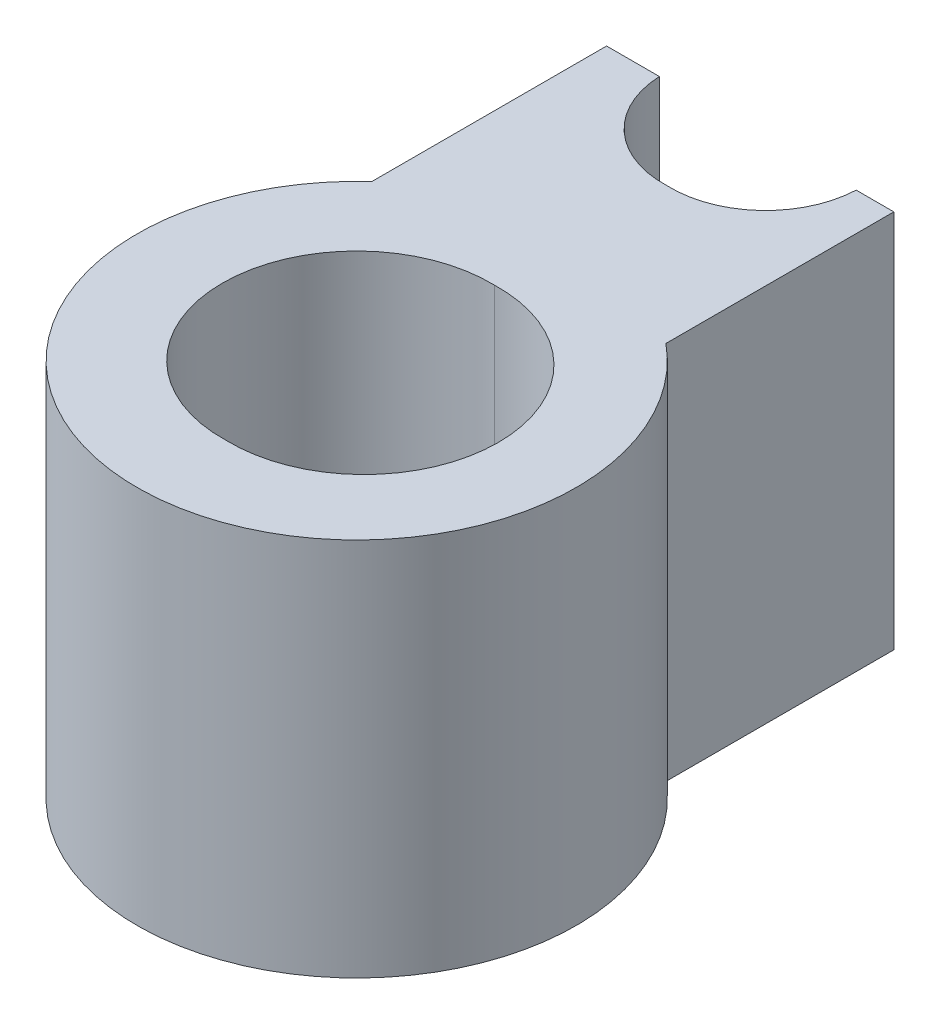
ISO-10303-21;
HEADER;
FILE_DESCRIPTION(('STEP AP214'),'2;1');
FILE_NAME('part.step','',(''),(''),'','','');
FILE_SCHEMA(('AUTOMOTIVE_DESIGN { 1 0 10303 214 1 1 1 1 }'));
ENDSEC;
DATA;
#1=APPLICATION_CONTEXT('core data for automotive mechanical design processes');
#2=APPLICATION_PROTOCOL_DEFINITION('international standard','automotive_design',2000,#1);
#3=PRODUCT_CONTEXT('',#1,'mechanical');
#4=PRODUCT('Part','Part','',(#3));
#5=PRODUCT_RELATED_PRODUCT_CATEGORY('part','',(#4));
#6=PRODUCT_DEFINITION_FORMATION('','',#4);
#7=PRODUCT_DEFINITION_CONTEXT('part definition',#1,'design');
#8=PRODUCT_DEFINITION('design','',#6,#7);
#9=PRODUCT_DEFINITION_SHAPE('','',#8);
#10=(LENGTH_UNIT() NAMED_UNIT(*) SI_UNIT(.MILLI.,.METRE.));
#11=(NAMED_UNIT(*) PLANE_ANGLE_UNIT() SI_UNIT($,.RADIAN.));
#12=(NAMED_UNIT(*) SI_UNIT($,.STERADIAN.) SOLID_ANGLE_UNIT());
#13=UNCERTAINTY_MEASURE_WITH_UNIT(LENGTH_MEASURE(1.E-05),#10,'distance_accuracy_value','');
#14=(GEOMETRIC_REPRESENTATION_CONTEXT(3) GLOBAL_UNCERTAINTY_ASSIGNED_CONTEXT((#13)) GLOBAL_UNIT_ASSIGNED_CONTEXT((#10,
#11,#12)) REPRESENTATION_CONTEXT('',''));
#15=CARTESIAN_POINT('',(0.,0.,0.));
#16=DIRECTION('',(0.,0.,1.));
#17=DIRECTION('',(1.,0.,0.));
#18=AXIS2_PLACEMENT_3D('',#15,#16,#17);
#19=CARTESIAN_POINT('',(1.26536763995187,2.87183105039429,15.59112871048));
#20=DIRECTION('',(0.,1.,0.));
#21=DIRECTION('',(0.,0.,-1.));
#22=AXIS2_PLACEMENT_3D('',#19,#20,#21);
#23=PLANE('',#22);
#24=CARTESIAN_POINT('',(-3.90353236004813,2.87183105039428,7.9584287104753));
#25=DIRECTION('',(0.,1.,0.));
#26=DIRECTION('',(0.,0.,1.));
#27=AXIS2_PLACEMENT_3D('',#24,#25,#26);
#28=CIRCLE('',#27,0.425);
#29=CARTESIAN_POINT('',(-3.91507375349743,2.87183105039428,8.38327197126359));
#30=VERTEX_POINT('',#29);
#31=CARTESIAN_POINT('',(-3.91507375349743,2.87183105039428,7.533585449687));
#32=VERTEX_POINT('',#31);
#33=EDGE_CURVE('E221',#30,#32,#28,.T.);
#34=ORIENTED_EDGE('',*,*,#33,.F.);
#35=CARTESIAN_POINT('',(-3.92661514694749,2.87183105039428,7.9584287104753));
#36=DIRECTION('',(0.,1.,0.));
#37=DIRECTION('',(0.,0.,1.));
#38=AXIS2_PLACEMENT_3D('',#35,#36,#37);
#39=CIRCLE('',#38,0.425);
#40=EDGE_CURVE('E153',#32,#30,#39,.T.);
#41=ORIENTED_EDGE('',*,*,#40,.F.);
#42=EDGE_LOOP('',(#34,#41));
#43=FACE_BOUND('',#42,.T.);
#44=DIRECTION('',(-5.02522919053297E-13,0.,1.));
#45=VECTOR('',#44,1.);
#46=CARTESIAN_POINT('',(-4.39342995083013,2.87183105039428,6.70112871047543));
#47=LINE('',#46,#45);
#48=CARTESIAN_POINT('',(-4.39342995083013,2.87183105039428,6.70112871047543));
#49=VERTEX_POINT('',#48);
#50=CARTESIAN_POINT('',(-4.3934299508305,2.87183105039428,7.44378108328629));
#51=VERTEX_POINT('',#50);
#52=EDGE_CURVE('E150',#49,#51,#47,.T.);
#53=ORIENTED_EDGE('',*,*,#52,.T.);
#54=CARTESIAN_POINT('',(-3.92661514694749,2.87183105039428,7.9584287104753));
#55=DIRECTION('',(0.,1.,0.));
#56=DIRECTION('',(0.,0.,1.));
#57=AXIS2_PLACEMENT_3D('',#54,#55,#56);
#58=CIRCLE('',#57,0.694822453073876);
#59=CARTESIAN_POINT('',(-3.48473605806802,2.87183105039429,7.42221875895757));
#60=VERTEX_POINT('',#59);
#61=EDGE_CURVE('E159',#51,#60,#58,.T.);
#62=ORIENTED_EDGE('',*,*,#61,.T.);
#63=DIRECTION('',(5.6636748734305E-13,0.,1.));
#64=VECTOR('',#63,1.);
#65=CARTESIAN_POINT('',(-3.48473605806843,2.87183105039428,6.70112871047504));
#66=LINE('',#65,#64);
#67=CARTESIAN_POINT('',(-3.48473605806843,2.87183105039428,6.70112871047504));
#68=VERTEX_POINT('',#67);
#69=EDGE_CURVE('E26',#68,#60,#66,.T.);
#70=ORIENTED_EDGE('',*,*,#69,.F.);
#71=DIRECTION('',(-1.,0.,1.62432664225037E-12));
#72=VECTOR('',#71,1.);
#73=CARTESIAN_POINT('',(-3.48473605806843,2.87183105039428,6.70112871047504));
#74=LINE('',#73,#72);
#75=CARTESIAN_POINT('',(-3.60380129724813,2.87183105039428,6.70112871047524));
#76=VERTEX_POINT('',#75);
#77=EDGE_CURVE('E11',#68,#76,#74,.T.);
#78=ORIENTED_EDGE('',*,*,#77,.T.);
#79=CARTESIAN_POINT('',(-3.90353236004815,2.87183105039428,6.68842871047527));
#80=DIRECTION('',(0.,1.,0.));
#81=DIRECTION('',(-0.999103542626009,0.,0.0423333333457055));
#82=AXIS2_PLACEMENT_3D('',#79,#80,#81);
#83=CIRCLE('',#82,0.299999999999993);
#84=CARTESIAN_POINT('',(-3.91507375349834,2.87183105039428,6.98820662199854));
#85=VERTEX_POINT('',#84);
#86=EDGE_CURVE('E112',#85,#76,#83,.T.);
#87=ORIENTED_EDGE('',*,*,#86,.F.);
#88=CARTESIAN_POINT('',(-3.92661514694751,2.87183105039428,6.68842871047527));
#89=DIRECTION('',(0.,1.,0.));
#90=DIRECTION('',(-0.999103542626486,0.,0.0423333333344553));
#91=AXIS2_PLACEMENT_3D('',#88,#89,#90);
#92=CIRCLE('',#91,0.299999999999992);
#93=CARTESIAN_POINT('',(-4.22634620973545,2.87183105039428,6.70112871047561));
#94=VERTEX_POINT('',#93);
#95=EDGE_CURVE('E138',#94,#85,#92,.T.);
#96=ORIENTED_EDGE('',*,*,#95,.F.);
#97=DIRECTION('',(1.,0.,1.06337566312106E-12));
#98=VECTOR('',#97,1.);
#99=CARTESIAN_POINT('',(-4.39342995083013,2.87183105039428,6.70112871047543));
#100=LINE('',#99,#98);
#101=EDGE_CURVE('E144',#49,#94,#100,.T.);
#102=ORIENTED_EDGE('',*,*,#101,.F.);
#103=EDGE_LOOP('',(#53,#62,#70,#78,#87,#96,#102));
#104=FACE_BOUND('',#103,.T.);
#105=ADVANCED_FACE('F17',(#43,#104),#23,.T.);
#106=CARTESIAN_POINT('',(-3.60380129724813,2.87183105039428,6.70112871047524));
#107=DIRECTION('',(-1.62432664225037E-12,0.,-1.));
#108=DIRECTION('',(-1.,0.,1.62432664225037E-12));
#109=AXIS2_PLACEMENT_3D('',#106,#107,#108);
#110=PLANE('',#109);
#111=DIRECTION('',(-1.,0.,1.62432664225037E-12));
#112=VECTOR('',#111,1.);
#113=CARTESIAN_POINT('',(-1.16921682865535,1.6718310055699,6.70112871047128));
#114=LINE('',#113,#112);
#115=CARTESIAN_POINT('',(-3.48473605806842,1.6718310055699,6.70112871047504));
#116=VERTEX_POINT('',#115);
#117=CARTESIAN_POINT('',(-3.60380129724812,1.6718310055699,6.70112871047524));
#118=VERTEX_POINT('',#117);
#119=EDGE_CURVE('E118',#116,#118,#114,.T.);
#120=ORIENTED_EDGE('',*,*,#119,.T.);
#121=DIRECTION('',(0.,-1.,0.));
#122=VECTOR('',#121,1.);
#123=CARTESIAN_POINT('',(-3.60380129724813,2.87183105039428,6.70112871047524));
#124=LINE('',#123,#122);
#125=EDGE_CURVE('E115',#76,#118,#124,.T.);
#126=ORIENTED_EDGE('',*,*,#125,.F.);
#127=ORIENTED_EDGE('',*,*,#77,.F.);
#128=DIRECTION('',(0.,-1.,0.));
#129=VECTOR('',#128,1.);
#130=CARTESIAN_POINT('',(-3.48473605806843,2.87183105039428,6.70112871047504));
#131=LINE('',#130,#129);
#132=EDGE_CURVE('E162',#68,#116,#131,.T.);
#133=ORIENTED_EDGE('',*,*,#132,.T.);
#134=EDGE_LOOP('',(#120,#126,#127,#133));
#135=FACE_BOUND('',#134,.T.);
#136=ADVANCED_FACE('F116',(#135),#110,.T.);
#137=CARTESIAN_POINT('',(-3.48473605806843,2.87183105039428,6.70112871047504));
#138=DIRECTION('',(1.,0.,-5.6636748734305E-13));
#139=DIRECTION('',(-5.6636748734305E-13,0.,-1.));
#140=AXIS2_PLACEMENT_3D('',#137,#138,#139);
#141=PLANE('',#140);
#142=DIRECTION('',(-5.6636748734305E-13,0.,-1.));
#143=VECTOR('',#142,1.);
#144=CARTESIAN_POINT('',(-3.48473605806591,1.6718310055699,11.1461287104789));
#145=LINE('',#144,#143);
#146=CARTESIAN_POINT('',(-3.48473605806801,1.6718310055699,7.42221875895757));
#147=VERTEX_POINT('',#146);
#148=EDGE_CURVE('E211',#147,#116,#145,.T.);
#149=ORIENTED_EDGE('',*,*,#148,.T.);
#150=ORIENTED_EDGE('',*,*,#132,.F.);
#151=ORIENTED_EDGE('',*,*,#69,.T.);
#152=DIRECTION('',(0.,-1.,0.));
#153=VECTOR('',#152,1.);
#154=CARTESIAN_POINT('',(-3.48473605806802,2.87183105039429,7.42221875895757));
#155=LINE('',#154,#153);
#156=EDGE_CURVE('E156',#60,#147,#155,.T.);
#157=ORIENTED_EDGE('',*,*,#156,.T.);
#158=EDGE_LOOP('',(#149,#150,#151,#157));
#159=FACE_BOUND('',#158,.T.);
#160=ADVANCED_FACE('F19',(#159),#141,.T.);
#161=CARTESIAN_POINT('',(-3.92661514694749,2.87183105039428,7.9584287104753));
#162=DIRECTION('',(0.,-1.,0.));
#163=DIRECTION('',(0.,0.,1.));
#164=AXIS2_PLACEMENT_3D('',#161,#162,#163);
#165=CYLINDRICAL_SURFACE('',#164,0.694822453073876);
#166=CARTESIAN_POINT('',(-3.92661514694749,1.6718310055699,7.9584287104753));
#167=DIRECTION('',(0.,1.,0.));
#168=DIRECTION('',(0.,0.,1.));
#169=AXIS2_PLACEMENT_3D('',#166,#167,#168);
#170=CIRCLE('',#169,0.694822453073876);
#171=CARTESIAN_POINT('',(-4.3934299508305,1.6718310055699,7.44378108328629));
#172=VERTEX_POINT('',#171);
#173=EDGE_CURVE('E216',#172,#147,#170,.T.);
#174=ORIENTED_EDGE('',*,*,#173,.T.);
#175=ORIENTED_EDGE('',*,*,#156,.F.);
#176=ORIENTED_EDGE('',*,*,#61,.F.);
#177=DIRECTION('',(0.,-1.,0.));
#178=VECTOR('',#177,1.);
#179=CARTESIAN_POINT('',(-4.3934299508305,2.87183105039428,7.44378108328629));
#180=LINE('',#179,#178);
#181=EDGE_CURVE('E147',#51,#172,#180,.T.);
#182=ORIENTED_EDGE('',*,*,#181,.T.);
#183=EDGE_LOOP('',(#174,#175,#176,#182));
#184=FACE_BOUND('',#183,.T.);
#185=ADVANCED_FACE('F302',(#184),#165,.T.);
#186=CARTESIAN_POINT('',(-3.92661514694749,2.87183105039428,7.9584287104753));
#187=DIRECTION('',(0.,-1.,0.));
#188=DIRECTION('',(-1.,0.,0.));
#189=AXIS2_PLACEMENT_3D('',#186,#187,#188);
#190=CYLINDRICAL_SURFACE('',#189,0.425);
#191=CARTESIAN_POINT('',(-3.92661514694749,1.6718310055699,7.9584287104753));
#192=DIRECTION('',(0.,-1.,0.));
#193=DIRECTION('',(0.,0.,1.));
#194=AXIS2_PLACEMENT_3D('',#191,#192,#193);
#195=CIRCLE('',#194,0.425);
#196=CARTESIAN_POINT('',(-3.91507375349742,1.6718310055699,8.38327197126359));
#197=VERTEX_POINT('',#196);
#198=CARTESIAN_POINT('',(-3.91507375349742,1.6718310055699,7.533585449687));
#199=VERTEX_POINT('',#198);
#200=EDGE_CURVE('E241',#197,#199,#195,.T.);
#201=ORIENTED_EDGE('',*,*,#200,.T.);
#202=DIRECTION('',(0.,-1.,0.));
#203=VECTOR('',#202,1.);
#204=CARTESIAN_POINT('',(-3.91507375349743,2.87183105039428,7.533585449687));
#205=LINE('',#204,#203);
#206=EDGE_CURVE('E133',#32,#199,#205,.T.);
#207=ORIENTED_EDGE('',*,*,#206,.F.);
#208=ORIENTED_EDGE('',*,*,#40,.T.);
#209=DIRECTION('',(0.,-1.,0.));
#210=VECTOR('',#209,1.);
#211=CARTESIAN_POINT('',(-3.91507375349743,2.87183105039428,8.38327197126359));
#212=LINE('',#211,#210);
#213=EDGE_CURVE('E226',#30,#197,#212,.T.);
#214=ORIENTED_EDGE('',*,*,#213,.T.);
#215=EDGE_LOOP('',(#201,#207,#208,#214));
#216=FACE_BOUND('',#215,.T.);
#217=ADVANCED_FACE('F331',(#216),#190,.F.);
#218=CARTESIAN_POINT('',(-4.3934299508305,2.87183105039428,7.44378108328629));
#219=DIRECTION('',(-1.,0.,-5.02522919053297E-13));
#220=DIRECTION('',(-5.02522919053297E-13,0.,1.));
#221=AXIS2_PLACEMENT_3D('',#218,#219,#220);
#222=PLANE('',#221);
#223=DIRECTION('',(-5.02522919053297E-13,0.,1.));
#224=VECTOR('',#223,1.);
#225=CARTESIAN_POINT('',(-4.39342995083255,1.6718310055699,11.5174548968817));
#226=LINE('',#225,#224);
#227=CARTESIAN_POINT('',(-4.39342995083012,1.6718310055699,6.70112871047543));
#228=VERTEX_POINT('',#227);
#229=EDGE_CURVE('E252',#228,#172,#226,.T.);
#230=ORIENTED_EDGE('',*,*,#229,.T.);
#231=ORIENTED_EDGE('',*,*,#181,.F.);
#232=ORIENTED_EDGE('',*,*,#52,.F.);
#233=DIRECTION('',(0.,-1.,0.));
#234=VECTOR('',#233,1.);
#235=CARTESIAN_POINT('',(-4.39342995083013,2.87183105039428,6.70112871047543));
#236=LINE('',#235,#234);
#237=EDGE_CURVE('E141',#49,#228,#236,.T.);
#238=ORIENTED_EDGE('',*,*,#237,.T.);
#239=EDGE_LOOP('',(#230,#231,#232,#238));
#240=FACE_BOUND('',#239,.T.);
#241=ADVANCED_FACE('F293',(#240),#222,.T.);
#242=CARTESIAN_POINT('',(-4.39342995083013,2.87183105039428,6.70112871047543));
#243=DIRECTION('',(1.06337566312106E-12,0.,-1.));
#244=DIRECTION('',(0.,-1.,0.));
#245=AXIS2_PLACEMENT_3D('',#242,#243,#244);
#246=PLANE('',#245);
#247=DIRECTION('',(-1.,0.,-1.06337566312106E-12));
#248=VECTOR('',#247,1.);
#249=CARTESIAN_POINT('',(-1.5640311554344,1.6718310055699,6.70112871047844));
#250=LINE('',#249,#248);
#251=CARTESIAN_POINT('',(-4.22634620973544,1.6718310055699,6.70112871047561));
#252=VERTEX_POINT('',#251);
#253=EDGE_CURVE('E264',#252,#228,#250,.T.);
#254=ORIENTED_EDGE('',*,*,#253,.T.);
#255=ORIENTED_EDGE('',*,*,#237,.F.);
#256=ORIENTED_EDGE('',*,*,#101,.T.);
#257=DIRECTION('',(0.,-1.,0.));
#258=VECTOR('',#257,1.);
#259=CARTESIAN_POINT('',(-4.22634620973545,2.87183105039428,6.70112871047561));
#260=LINE('',#259,#258);
#261=EDGE_CURVE('E123',#94,#252,#260,.T.);
#262=ORIENTED_EDGE('',*,*,#261,.T.);
#263=EDGE_LOOP('',(#254,#255,#256,#262));
#264=FACE_BOUND('',#263,.T.);
#265=ADVANCED_FACE('F306',(#264),#246,.T.);
#266=CARTESIAN_POINT('',(-3.92661514694751,2.87183105039428,6.68842871047527));
#267=DIRECTION('',(0.,-1.,0.));
#268=DIRECTION('',(-0.999103542626486,0.,0.0423333333344553));
#269=AXIS2_PLACEMENT_3D('',#266,#267,#268);
#270=CYLINDRICAL_SURFACE('',#269,0.299999999999992);
#271=CARTESIAN_POINT('',(-3.92661514694751,1.6718310055699,6.68842871047527));
#272=DIRECTION('',(0.,-1.,0.));
#273=DIRECTION('',(-0.999103542626486,0.,0.0423333333344553));
#274=AXIS2_PLACEMENT_3D('',#271,#272,#273);
#275=CIRCLE('',#274,0.299999999999992);
#276=CARTESIAN_POINT('',(-3.91507375349833,1.6718310055699,6.98820662199854));
#277=VERTEX_POINT('',#276);
#278=EDGE_CURVE('E269',#277,#252,#275,.T.);
#279=ORIENTED_EDGE('',*,*,#278,.T.);
#280=ORIENTED_EDGE('',*,*,#261,.F.);
#281=ORIENTED_EDGE('',*,*,#95,.T.);
#282=DIRECTION('',(0.,-1.,0.));
#283=VECTOR('',#282,1.);
#284=CARTESIAN_POINT('',(-3.91507375349834,2.87183105039428,6.98820662199854));
#285=LINE('',#284,#283);
#286=EDGE_CURVE('E126',#85,#277,#285,.T.);
#287=ORIENTED_EDGE('',*,*,#286,.T.);
#288=EDGE_LOOP('',(#279,#280,#281,#287));
#289=FACE_BOUND('',#288,.T.);
#290=ADVANCED_FACE('F308',(#289),#270,.F.);
#291=CARTESIAN_POINT('',(-3.90353236004815,2.87183105039428,6.68842871047527));
#292=DIRECTION('',(0.,-1.,0.));
#293=DIRECTION('',(-0.999103542626009,0.,0.0423333333457054));
#294=AXIS2_PLACEMENT_3D('',#291,#292,#293);
#295=CYLINDRICAL_SURFACE('',#294,0.299999999999993);
#296=CARTESIAN_POINT('',(-3.90353236004815,1.6718310055699,6.68842871047527));
#297=DIRECTION('',(0.,-1.,0.));
#298=DIRECTION('',(-0.999103542626009,0.,0.0423333333457055));
#299=AXIS2_PLACEMENT_3D('',#296,#297,#298);
#300=CIRCLE('',#299,0.299999999999993);
#301=EDGE_CURVE('E275',#118,#277,#300,.T.);
#302=ORIENTED_EDGE('',*,*,#301,.T.);
#303=ORIENTED_EDGE('',*,*,#286,.F.);
#304=ORIENTED_EDGE('',*,*,#86,.T.);
#305=ORIENTED_EDGE('',*,*,#125,.T.);
#306=EDGE_LOOP('',(#302,#303,#304,#305));
#307=FACE_BOUND('',#306,.T.);
#308=ADVANCED_FACE('F125',(#307),#295,.F.);
#309=CARTESIAN_POINT('',(-3.90353236004813,2.87183105039428,7.9584287104753));
#310=DIRECTION('',(0.,-1.,0.));
#311=DIRECTION('',(1.,0.,0.));
#312=AXIS2_PLACEMENT_3D('',#309,#310,#311);
#313=CYLINDRICAL_SURFACE('',#312,0.425);
#314=CARTESIAN_POINT('',(-3.90353236004813,1.6718310055699,7.9584287104753));
#315=DIRECTION('',(0.,-1.,0.));
#316=DIRECTION('',(0.,0.,1.));
#317=AXIS2_PLACEMENT_3D('',#314,#315,#316);
#318=CIRCLE('',#317,0.425);
#319=EDGE_CURVE('E234',#199,#197,#318,.T.);
#320=ORIENTED_EDGE('',*,*,#319,.T.);
#321=ORIENTED_EDGE('',*,*,#213,.F.);
#322=ORIENTED_EDGE('',*,*,#33,.T.);
#323=ORIENTED_EDGE('',*,*,#206,.T.);
#324=EDGE_LOOP('',(#320,#321,#322,#323));
#325=FACE_BOUND('',#324,.T.);
#326=ADVANCED_FACE('F316',(#325),#313,.F.);
#327=CARTESIAN_POINT('',(1.26536763995188,1.6718310055699,15.59112871048));
#328=DIRECTION('',(0.,1.,0.));
#329=DIRECTION('',(0.,0.,-1.));
#330=AXIS2_PLACEMENT_3D('',#327,#328,#329);
#331=PLANE('',#330);
#332=ORIENTED_EDGE('',*,*,#319,.F.);
#333=ORIENTED_EDGE('',*,*,#200,.F.);
#334=EDGE_LOOP('',(#332,#333));
#335=FACE_BOUND('',#334,.T.);
#336=ORIENTED_EDGE('',*,*,#229,.F.);
#337=ORIENTED_EDGE('',*,*,#253,.F.);
#338=ORIENTED_EDGE('',*,*,#278,.F.);
#339=ORIENTED_EDGE('',*,*,#301,.F.);
#340=ORIENTED_EDGE('',*,*,#119,.F.);
#341=ORIENTED_EDGE('',*,*,#148,.F.);
#342=ORIENTED_EDGE('',*,*,#173,.F.);
#343=EDGE_LOOP('',(#336,#337,#338,#339,#340,#341,#342));
#344=FACE_BOUND('',#343,.T.);
#345=ADVANCED_FACE('F298',(#335,#344),#331,.F.);
#346=CLOSED_SHELL('',(#105,#136,#160,#185,#217,#241,#265,#290,#308,#326,#345));
#347=MANIFOLD_SOLID_BREP('B1',#346);
#348=ADVANCED_BREP_SHAPE_REPRESENTATION('',(#18,#347),#14);
#349=SHAPE_DEFINITION_REPRESENTATION(#9,#348);
ENDSEC;
END-ISO-10303-21;
